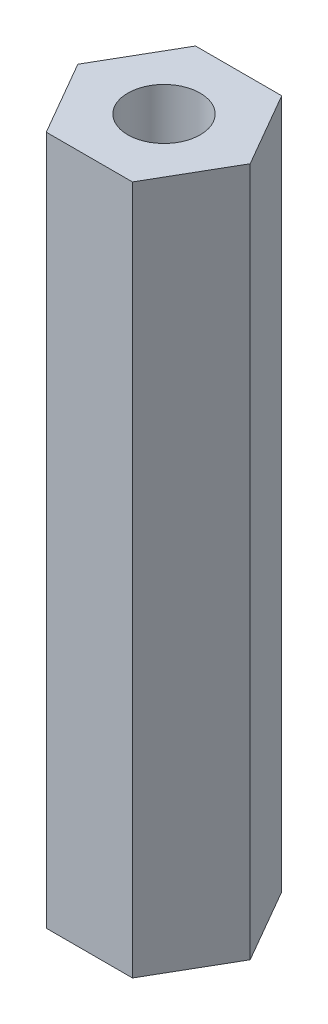
ISO-10303-21;
HEADER;
FILE_DESCRIPTION(('STEP AP214'),'2;1');
FILE_NAME('part.step','',(''),(''),'','','');
FILE_SCHEMA(('AUTOMOTIVE_DESIGN { 1 0 10303 214 1 1 1 1 }'));
ENDSEC;
DATA;
#1=APPLICATION_CONTEXT('core data for automotive mechanical design processes');
#2=APPLICATION_PROTOCOL_DEFINITION('international standard','automotive_design',2000,#1);
#3=PRODUCT_CONTEXT('',#1,'mechanical');
#4=PRODUCT('Part','Part','',(#3));
#5=PRODUCT_RELATED_PRODUCT_CATEGORY('part','',(#4));
#6=PRODUCT_DEFINITION_FORMATION('','',#4);
#7=PRODUCT_DEFINITION_CONTEXT('part definition',#1,'design');
#8=PRODUCT_DEFINITION('design','',#6,#7);
#9=PRODUCT_DEFINITION_SHAPE('','',#8);
#10=(LENGTH_UNIT() NAMED_UNIT(*) SI_UNIT(.MILLI.,.METRE.));
#11=(NAMED_UNIT(*) PLANE_ANGLE_UNIT() SI_UNIT($,.RADIAN.));
#12=(NAMED_UNIT(*) SI_UNIT($,.STERADIAN.) SOLID_ANGLE_UNIT());
#13=UNCERTAINTY_MEASURE_WITH_UNIT(LENGTH_MEASURE(1.E-05),#10,'distance_accuracy_value','');
#14=(GEOMETRIC_REPRESENTATION_CONTEXT(3) GLOBAL_UNCERTAINTY_ASSIGNED_CONTEXT((#13)) GLOBAL_UNIT_ASSIGNED_CONTEXT((#10,
#11,#12)) REPRESENTATION_CONTEXT('',''));
#15=CARTESIAN_POINT('',(0.,0.,0.));
#16=DIRECTION('',(0.,0.,1.));
#17=DIRECTION('',(1.,0.,0.));
#18=AXIS2_PLACEMENT_3D('',#15,#16,#17);
#19=CARTESIAN_POINT('',(0.,40.,0.));
#20=DIRECTION('',(0.,-1.,0.));
#21=DIRECTION('',(0.,0.,-1.));
#22=AXIS2_PLACEMENT_3D('',#19,#20,#21);
#23=CYLINDRICAL_SURFACE('',#22,2.1);
#24=CARTESIAN_POINT('',(0.,0.,0.));
#25=DIRECTION('',(0.,1.,0.));
#26=DIRECTION('',(0.,0.,1.));
#27=AXIS2_PLACEMENT_3D('',#24,#25,#26);
#28=CIRCLE('',#27,2.1);
#29=CARTESIAN_POINT('',(0.,0.,2.1));
#30=VERTEX_POINT('',#29);
#31=EDGE_CURVE('E184',#30,#30,#28,.T.);
#32=ORIENTED_EDGE('',*,*,#31,.F.);
#33=EDGE_LOOP('',(#32));
#34=FACE_BOUND('',#33,.T.);
#35=CARTESIAN_POINT('',(0.,6.,0.));
#36=DIRECTION('',(0.,1.,0.));
#37=DIRECTION('',(0.,0.,1.));
#38=AXIS2_PLACEMENT_3D('',#35,#36,#37);
#39=CIRCLE('',#38,2.1);
#40=CARTESIAN_POINT('',(0.,6.,2.1));
#41=VERTEX_POINT('',#40);
#42=EDGE_CURVE('E188',#41,#41,#39,.F.);
#43=ORIENTED_EDGE('',*,*,#42,.F.);
#44=EDGE_LOOP('',(#43));
#45=FACE_BOUND('',#44,.T.);
#46=ADVANCED_FACE('F47',(#34,#45),#23,.F.);
#47=CARTESIAN_POINT('',(0.,40.,0.));
#48=DIRECTION('',(0.,1.,0.));
#49=DIRECTION('',(0.,0.,1.));
#50=AXIS2_PLACEMENT_3D('',#47,#48,#49);
#51=PLANE('',#50);
#52=DIRECTION('',(0.5,0.,-0.866025403784439));
#53=VECTOR('',#52,1.);
#54=CARTESIAN_POINT('',(2.5,40.,4.3301270189222));
#55=LINE('',#54,#53);
#56=CARTESIAN_POINT('',(2.5,40.,4.3301270189222));
#57=VERTEX_POINT('',#56);
#58=CARTESIAN_POINT('',(5.,40.,0.));
#59=VERTEX_POINT('',#58);
#60=EDGE_CURVE('E156',#57,#59,#55,.T.);
#61=ORIENTED_EDGE('',*,*,#60,.T.);
#62=DIRECTION('',(-0.5,0.,-0.866025403784438));
#63=VECTOR('',#62,1.);
#64=CARTESIAN_POINT('',(5.,40.,0.));
#65=LINE('',#64,#63);
#66=CARTESIAN_POINT('',(2.5,40.,-4.3301270189222));
#67=VERTEX_POINT('',#66);
#68=EDGE_CURVE('E103',#59,#67,#65,.T.);
#69=ORIENTED_EDGE('',*,*,#68,.T.);
#70=DIRECTION('',(-1.,0.,0.));
#71=VECTOR('',#70,1.);
#72=CARTESIAN_POINT('',(2.5,40.,-4.3301270189222));
#73=LINE('',#72,#71);
#74=CARTESIAN_POINT('',(-2.5,40.,-4.3301270189222));
#75=VERTEX_POINT('',#74);
#76=EDGE_CURVE('E117',#67,#75,#73,.T.);
#77=ORIENTED_EDGE('',*,*,#76,.T.);
#78=DIRECTION('',(-0.5,0.,0.866025403784439));
#79=VECTOR('',#78,1.);
#80=CARTESIAN_POINT('',(-2.5,40.,-4.3301270189222));
#81=LINE('',#80,#79);
#82=CARTESIAN_POINT('',(-5.,40.,0.));
#83=VERTEX_POINT('',#82);
#84=EDGE_CURVE('E110',#75,#83,#81,.T.);
#85=ORIENTED_EDGE('',*,*,#84,.T.);
#86=DIRECTION('',(0.5,0.,0.866025403784439));
#87=VECTOR('',#86,1.);
#88=CARTESIAN_POINT('',(-5.,40.,0.));
#89=LINE('',#88,#87);
#90=CARTESIAN_POINT('',(-2.5,40.,4.3301270189222));
#91=VERTEX_POINT('',#90);
#92=EDGE_CURVE('E115',#83,#91,#89,.T.);
#93=ORIENTED_EDGE('',*,*,#92,.T.);
#94=DIRECTION('',(1.,0.,0.));
#95=VECTOR('',#94,1.);
#96=CARTESIAN_POINT('',(-2.5,40.,4.3301270189222));
#97=LINE('',#96,#95);
#98=EDGE_CURVE('E65',#91,#57,#97,.T.);
#99=ORIENTED_EDGE('',*,*,#98,.T.);
#100=EDGE_LOOP('',(#61,#69,#77,#85,#93,#99));
#101=FACE_BOUND('',#100,.T.);
#102=CARTESIAN_POINT('',(0.,40.,0.));
#103=DIRECTION('',(0.,1.,0.));
#104=DIRECTION('',(0.,0.,1.));
#105=AXIS2_PLACEMENT_3D('',#102,#103,#104);
#106=CIRCLE('',#105,2.1);
#107=CARTESIAN_POINT('',(0.,40.,2.1));
#108=VERTEX_POINT('',#107);
#109=EDGE_CURVE('E144',#108,#108,#106,.T.);
#110=ORIENTED_EDGE('',*,*,#109,.F.);
#111=EDGE_LOOP('',(#110));
#112=FACE_BOUND('',#111,.T.);
#113=ADVANCED_FACE('F112',(#101,#112),#51,.T.);
#114=CARTESIAN_POINT('',(0.,0.,0.));
#115=DIRECTION('',(0.,1.,0.));
#116=DIRECTION('',(0.,0.,1.));
#117=AXIS2_PLACEMENT_3D('',#114,#115,#116);
#118=PLANE('',#117);
#119=DIRECTION('',(0.5,0.,-0.866025403784439));
#120=VECTOR('',#119,1.);
#121=CARTESIAN_POINT('',(2.5,0.,4.3301270189222));
#122=LINE('',#121,#120);
#123=CARTESIAN_POINT('',(2.5,0.,4.3301270189222));
#124=VERTEX_POINT('',#123);
#125=CARTESIAN_POINT('',(5.,0.,0.));
#126=VERTEX_POINT('',#125);
#127=EDGE_CURVE('E139',#124,#126,#122,.T.);
#128=ORIENTED_EDGE('',*,*,#127,.F.);
#129=DIRECTION('',(1.,0.,0.));
#130=VECTOR('',#129,1.);
#131=CARTESIAN_POINT('',(-2.5,0.,4.3301270189222));
#132=LINE('',#131,#130);
#133=CARTESIAN_POINT('',(-2.5,0.,4.3301270189222));
#134=VERTEX_POINT('',#133);
#135=EDGE_CURVE('E94',#134,#124,#132,.T.);
#136=ORIENTED_EDGE('',*,*,#135,.F.);
#137=DIRECTION('',(0.5,0.,0.866025403784439));
#138=VECTOR('',#137,1.);
#139=CARTESIAN_POINT('',(-5.,0.,0.));
#140=LINE('',#139,#138);
#141=CARTESIAN_POINT('',(-5.,0.,0.));
#142=VERTEX_POINT('',#141);
#143=EDGE_CURVE('E88',#142,#134,#140,.T.);
#144=ORIENTED_EDGE('',*,*,#143,.F.);
#145=DIRECTION('',(-0.5,0.,0.866025403784439));
#146=VECTOR('',#145,1.);
#147=CARTESIAN_POINT('',(-2.5,0.,-4.3301270189222));
#148=LINE('',#147,#146);
#149=CARTESIAN_POINT('',(-2.5,0.,-4.3301270189222));
#150=VERTEX_POINT('',#149);
#151=EDGE_CURVE('E126',#150,#142,#148,.T.);
#152=ORIENTED_EDGE('',*,*,#151,.F.);
#153=DIRECTION('',(-1.,0.,0.));
#154=VECTOR('',#153,1.);
#155=CARTESIAN_POINT('',(2.5,0.,-4.3301270189222));
#156=LINE('',#155,#154);
#157=CARTESIAN_POINT('',(2.5,0.,-4.3301270189222));
#158=VERTEX_POINT('',#157);
#159=EDGE_CURVE('E147',#158,#150,#156,.T.);
#160=ORIENTED_EDGE('',*,*,#159,.F.);
#161=DIRECTION('',(-0.5,0.,-0.866025403784438));
#162=VECTOR('',#161,1.);
#163=CARTESIAN_POINT('',(5.,0.,0.));
#164=LINE('',#163,#162);
#165=EDGE_CURVE('E143',#126,#158,#164,.T.);
#166=ORIENTED_EDGE('',*,*,#165,.F.);
#167=EDGE_LOOP('',(#128,#136,#144,#152,#160,#166));
#168=FACE_BOUND('',#167,.T.);
#169=ORIENTED_EDGE('',*,*,#31,.T.);
#170=EDGE_LOOP('',(#169));
#171=FACE_BOUND('',#170,.T.);
#172=ADVANCED_FACE('F173',(#168,#171),#118,.F.);
#173=CARTESIAN_POINT('',(2.5,40.,4.3301270189222));
#174=DIRECTION('',(-0.866025403784439,0.,-0.5));
#175=DIRECTION('',(-0.5,0.,0.866025403784439));
#176=AXIS2_PLACEMENT_3D('',#173,#174,#175);
#177=PLANE('',#176);
#178=ORIENTED_EDGE('',*,*,#127,.T.);
#179=DIRECTION('',(0.,-1.,0.));
#180=VECTOR('',#179,1.);
#181=CARTESIAN_POINT('',(5.,40.,0.));
#182=LINE('',#181,#180);
#183=EDGE_CURVE('E57',#59,#126,#182,.T.);
#184=ORIENTED_EDGE('',*,*,#183,.F.);
#185=ORIENTED_EDGE('',*,*,#60,.F.);
#186=DIRECTION('',(0.,-1.,0.));
#187=VECTOR('',#186,1.);
#188=CARTESIAN_POINT('',(2.5,40.,4.3301270189222));
#189=LINE('',#188,#187);
#190=EDGE_CURVE('E135',#57,#124,#189,.T.);
#191=ORIENTED_EDGE('',*,*,#190,.T.);
#192=EDGE_LOOP('',(#178,#184,#185,#191));
#193=FACE_BOUND('',#192,.T.);
#194=ADVANCED_FACE('F49',(#193),#177,.F.);
#195=CARTESIAN_POINT('',(5.,40.,0.));
#196=DIRECTION('',(-0.866025403784438,0.,0.5));
#197=DIRECTION('',(0.5,0.,0.866025403784439));
#198=AXIS2_PLACEMENT_3D('',#195,#196,#197);
#199=PLANE('',#198);
#200=ORIENTED_EDGE('',*,*,#165,.T.);
#201=DIRECTION('',(0.,-1.,0.));
#202=VECTOR('',#201,1.);
#203=CARTESIAN_POINT('',(2.5,40.,-4.3301270189222));
#204=LINE('',#203,#202);
#205=EDGE_CURVE('E163',#67,#158,#204,.T.);
#206=ORIENTED_EDGE('',*,*,#205,.F.);
#207=ORIENTED_EDGE('',*,*,#68,.F.);
#208=ORIENTED_EDGE('',*,*,#183,.T.);
#209=EDGE_LOOP('',(#200,#206,#207,#208));
#210=FACE_BOUND('',#209,.T.);
#211=ADVANCED_FACE('F168',(#210),#199,.F.);
#212=CARTESIAN_POINT('',(2.5,40.,-4.3301270189222));
#213=DIRECTION('',(0.,0.,1.));
#214=DIRECTION('',(1.,0.,0.));
#215=AXIS2_PLACEMENT_3D('',#212,#213,#214);
#216=PLANE('',#215);
#217=ORIENTED_EDGE('',*,*,#159,.T.);
#218=DIRECTION('',(0.,-1.,0.));
#219=VECTOR('',#218,1.);
#220=CARTESIAN_POINT('',(-2.5,40.,-4.3301270189222));
#221=LINE('',#220,#219);
#222=EDGE_CURVE('E128',#75,#150,#221,.T.);
#223=ORIENTED_EDGE('',*,*,#222,.F.);
#224=ORIENTED_EDGE('',*,*,#76,.F.);
#225=ORIENTED_EDGE('',*,*,#205,.T.);
#226=EDGE_LOOP('',(#217,#223,#224,#225));
#227=FACE_BOUND('',#226,.T.);
#228=ADVANCED_FACE('F177',(#227),#216,.F.);
#229=CARTESIAN_POINT('',(-2.5,40.,-4.3301270189222));
#230=DIRECTION('',(0.866025403784439,0.,0.5));
#231=DIRECTION('',(0.5,0.,-0.866025403784439));
#232=AXIS2_PLACEMENT_3D('',#229,#230,#231);
#233=PLANE('',#232);
#234=ORIENTED_EDGE('',*,*,#151,.T.);
#235=DIRECTION('',(0.,-1.,0.));
#236=VECTOR('',#235,1.);
#237=CARTESIAN_POINT('',(-5.,40.,0.));
#238=LINE('',#237,#236);
#239=EDGE_CURVE('E123',#83,#142,#238,.T.);
#240=ORIENTED_EDGE('',*,*,#239,.F.);
#241=ORIENTED_EDGE('',*,*,#84,.F.);
#242=ORIENTED_EDGE('',*,*,#222,.T.);
#243=EDGE_LOOP('',(#234,#240,#241,#242));
#244=FACE_BOUND('',#243,.T.);
#245=ADVANCED_FACE('F124',(#244),#233,.F.);
#246=CARTESIAN_POINT('',(-5.,40.,0.));
#247=DIRECTION('',(0.866025403784439,0.,-0.5));
#248=DIRECTION('',(-0.5,0.,-0.866025403784439));
#249=AXIS2_PLACEMENT_3D('',#246,#247,#248);
#250=PLANE('',#249);
#251=ORIENTED_EDGE('',*,*,#143,.T.);
#252=DIRECTION('',(0.,-1.,0.));
#253=VECTOR('',#252,1.);
#254=CARTESIAN_POINT('',(-2.5,40.,4.3301270189222));
#255=LINE('',#254,#253);
#256=EDGE_CURVE('E129',#91,#134,#255,.T.);
#257=ORIENTED_EDGE('',*,*,#256,.F.);
#258=ORIENTED_EDGE('',*,*,#92,.F.);
#259=ORIENTED_EDGE('',*,*,#239,.T.);
#260=EDGE_LOOP('',(#251,#257,#258,#259));
#261=FACE_BOUND('',#260,.T.);
#262=ADVANCED_FACE('F131',(#261),#250,.F.);
#263=CARTESIAN_POINT('',(-2.5,40.,4.3301270189222));
#264=DIRECTION('',(0.,0.,-1.));
#265=DIRECTION('',(-1.,0.,0.));
#266=AXIS2_PLACEMENT_3D('',#263,#264,#265);
#267=PLANE('',#266);
#268=ORIENTED_EDGE('',*,*,#135,.T.);
#269=ORIENTED_EDGE('',*,*,#190,.F.);
#270=ORIENTED_EDGE('',*,*,#98,.F.);
#271=ORIENTED_EDGE('',*,*,#256,.T.);
#272=EDGE_LOOP('',(#268,#269,#270,#271));
#273=FACE_BOUND('',#272,.T.);
#274=ADVANCED_FACE('F210',(#273),#267,.F.);
#275=CARTESIAN_POINT('',(0.,34.,0.));
#276=DIRECTION('',(0.,1.,0.));
#277=DIRECTION('',(0.,0.,1.));
#278=AXIS2_PLACEMENT_3D('',#275,#276,#277);
#279=CIRCLE('',#278,2.1);
#280=CARTESIAN_POINT('',(0.,34.,2.1));
#281=VERTEX_POINT('',#280);
#282=EDGE_CURVE('E12',#281,#281,#279,.T.);
#283=ORIENTED_EDGE('',*,*,#282,.F.);
#284=EDGE_LOOP('',(#283));
#285=FACE_BOUND('',#284,.T.);
#286=ORIENTED_EDGE('',*,*,#109,.T.);
#287=EDGE_LOOP('',(#286));
#288=FACE_BOUND('',#287,.T.);
#289=ADVANCED_FACE('F201',(#285,#288),#23,.F.);
#290=CARTESIAN_POINT('',(0.,6.,0.));
#291=DIRECTION('',(0.,1.,0.));
#292=DIRECTION('',(0.,0.,1.));
#293=AXIS2_PLACEMENT_3D('',#290,#291,#292);
#294=PLANE('',#293);
#295=ORIENTED_EDGE('',*,*,#42,.T.);
#296=EDGE_LOOP('',(#295));
#297=FACE_BOUND('',#296,.T.);
#298=ADVANCED_FACE('F196',(#297),#294,.F.);
#299=CARTESIAN_POINT('',(0.,34.,0.));
#300=DIRECTION('',(0.,1.,0.));
#301=DIRECTION('',(0.,0.,1.));
#302=AXIS2_PLACEMENT_3D('',#299,#300,#301);
#303=PLANE('',#302);
#304=ORIENTED_EDGE('',*,*,#282,.T.);
#305=EDGE_LOOP('',(#304));
#306=FACE_BOUND('',#305,.T.);
#307=ADVANCED_FACE('F215',(#306),#303,.T.);
#308=CLOSED_SHELL('',(#46,#113,#172,#194,#211,#228,#245,#262,#274,#289,#298,#307));
#309=MANIFOLD_SOLID_BREP('B2',#308);
#310=ADVANCED_BREP_SHAPE_REPRESENTATION('',(#18,#309),#14);
#311=SHAPE_DEFINITION_REPRESENTATION(#9,#310);
ENDSEC;
END-ISO-10303-21;
